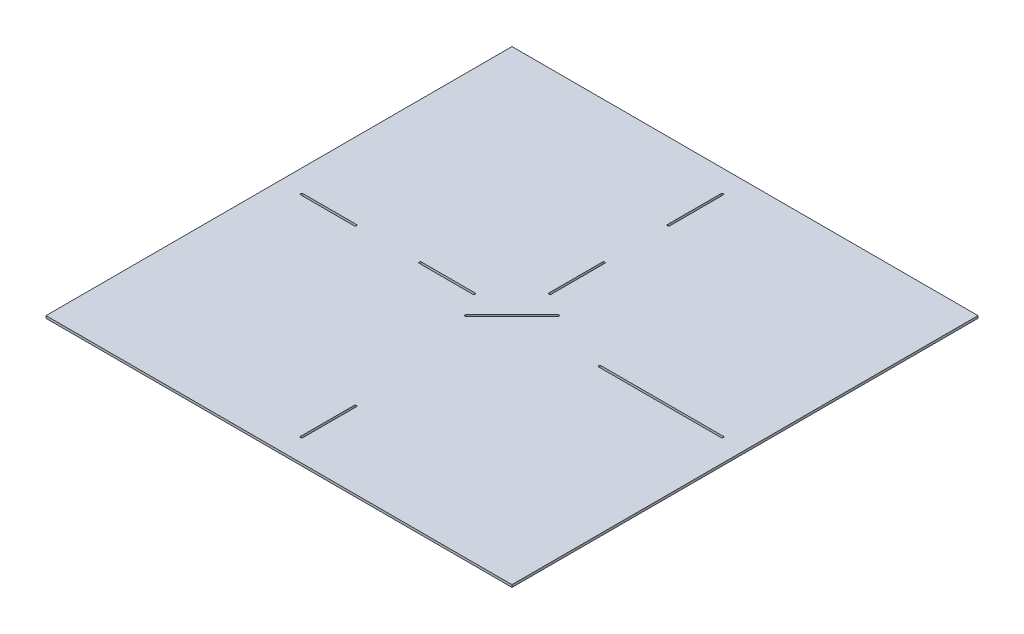
ISO-10303-21;
HEADER;
FILE_DESCRIPTION(('STEP AP214'),'2;1');
FILE_NAME('part.step','',(''),(''),'','','');
FILE_SCHEMA(('AUTOMOTIVE_DESIGN { 1 0 10303 214 1 1 1 1 }'));
ENDSEC;
DATA;
#1=APPLICATION_CONTEXT('core data for automotive mechanical design processes');
#2=APPLICATION_PROTOCOL_DEFINITION('international standard','automotive_design',2000,#1);
#3=PRODUCT_CONTEXT('',#1,'mechanical');
#4=PRODUCT('Part','Part','',(#3));
#5=PRODUCT_RELATED_PRODUCT_CATEGORY('part','',(#4));
#6=PRODUCT_DEFINITION_FORMATION('','',#4);
#7=PRODUCT_DEFINITION_CONTEXT('part definition',#1,'design');
#8=PRODUCT_DEFINITION('design','',#6,#7);
#9=PRODUCT_DEFINITION_SHAPE('','',#8);
#10=(LENGTH_UNIT() NAMED_UNIT(*) SI_UNIT(.MILLI.,.METRE.));
#11=(NAMED_UNIT(*) PLANE_ANGLE_UNIT() SI_UNIT($,.RADIAN.));
#12=(NAMED_UNIT(*) SI_UNIT($,.STERADIAN.) SOLID_ANGLE_UNIT());
#13=UNCERTAINTY_MEASURE_WITH_UNIT(LENGTH_MEASURE(1.E-05),#10,'distance_accuracy_value','');
#14=(GEOMETRIC_REPRESENTATION_CONTEXT(3) GLOBAL_UNCERTAINTY_ASSIGNED_CONTEXT((#13)) GLOBAL_UNIT_ASSIGNED_CONTEXT((#10,
#11,#12)) REPRESENTATION_CONTEXT('',''));
#15=CARTESIAN_POINT('',(0.,0.,0.));
#16=DIRECTION('',(0.,0.,1.));
#17=DIRECTION('',(1.,0.,0.));
#18=AXIS2_PLACEMENT_3D('',#15,#16,#17);
#19=CARTESIAN_POINT('',(304.8,3.175,304.8));
#20=DIRECTION('',(-1.,0.,0.));
#21=DIRECTION('',(0.,0.,1.));
#22=AXIS2_PLACEMENT_3D('',#19,#20,#21);
#23=PLANE('',#22);
#24=DIRECTION('',(0.,0.,-1.));
#25=VECTOR('',#24,1.);
#26=CARTESIAN_POINT('',(304.8,0.,304.8));
#27=LINE('',#26,#25);
#28=CARTESIAN_POINT('',(304.8,0.,304.8));
#29=VERTEX_POINT('',#28);
#30=CARTESIAN_POINT('',(304.8,0.,-304.8));
#31=VERTEX_POINT('',#30);
#32=EDGE_CURVE('E466',#29,#31,#27,.T.);
#33=ORIENTED_EDGE('',*,*,#32,.T.);
#34=DIRECTION('',(0.,-1.,0.));
#35=VECTOR('',#34,1.);
#36=CARTESIAN_POINT('',(304.8,3.175,-304.8));
#37=LINE('',#36,#35);
#38=CARTESIAN_POINT('',(304.8,3.175,-304.8));
#39=VERTEX_POINT('',#38);
#40=EDGE_CURVE('E11',#39,#31,#37,.T.);
#41=ORIENTED_EDGE('',*,*,#40,.F.);
#42=DIRECTION('',(0.,0.,-1.));
#43=VECTOR('',#42,1.);
#44=CARTESIAN_POINT('',(304.8,3.175,304.8));
#45=LINE('',#44,#43);
#46=CARTESIAN_POINT('',(304.8,3.175,304.8));
#47=VERTEX_POINT('',#46);
#48=EDGE_CURVE('E473',#47,#39,#45,.T.);
#49=ORIENTED_EDGE('',*,*,#48,.F.);
#50=DIRECTION('',(0.,-1.,0.));
#51=VECTOR('',#50,1.);
#52=CARTESIAN_POINT('',(304.8,3.175,304.8));
#53=LINE('',#52,#51);
#54=EDGE_CURVE('E483',#47,#29,#53,.T.);
#55=ORIENTED_EDGE('',*,*,#54,.T.);
#56=EDGE_LOOP('',(#33,#41,#49,#55));
#57=FACE_BOUND('',#56,.T.);
#58=ADVANCED_FACE('F33',(#57),#23,.F.);
#59=CARTESIAN_POINT('',(-304.8,3.175,-304.8));
#60=DIRECTION('',(0.,0.,1.));
#61=DIRECTION('',(1.,0.,0.));
#62=AXIS2_PLACEMENT_3D('',#59,#60,#61);
#63=PLANE('',#62);
#64=DIRECTION('',(-1.,0.,0.));
#65=VECTOR('',#64,1.);
#66=CARTESIAN_POINT('',(-304.8,0.,-304.8));
#67=LINE('',#66,#65);
#68=CARTESIAN_POINT('',(-304.8,0.,-304.8));
#69=VERTEX_POINT('',#68);
#70=EDGE_CURVE('E486',#31,#69,#67,.T.);
#71=ORIENTED_EDGE('',*,*,#70,.T.);
#72=DIRECTION('',(0.,-1.,0.));
#73=VECTOR('',#72,1.);
#74=CARTESIAN_POINT('',(-304.8,3.175,-304.8));
#75=LINE('',#74,#73);
#76=CARTESIAN_POINT('',(-304.8,3.175,-304.8));
#77=VERTEX_POINT('',#76);
#78=EDGE_CURVE('E40',#77,#69,#75,.T.);
#79=ORIENTED_EDGE('',*,*,#78,.F.);
#80=DIRECTION('',(-1.,0.,0.));
#81=VECTOR('',#80,1.);
#82=CARTESIAN_POINT('',(-304.8,3.175,-304.8));
#83=LINE('',#82,#81);
#84=EDGE_CURVE('E476',#39,#77,#83,.T.);
#85=ORIENTED_EDGE('',*,*,#84,.F.);
#86=ORIENTED_EDGE('',*,*,#40,.T.);
#87=EDGE_LOOP('',(#71,#79,#85,#86));
#88=FACE_BOUND('',#87,.T.);
#89=ADVANCED_FACE('F515',(#88),#63,.F.);
#90=CARTESIAN_POINT('',(-304.8,3.175,304.8));
#91=DIRECTION('',(1.,0.,0.));
#92=DIRECTION('',(0.,0.,-1.));
#93=AXIS2_PLACEMENT_3D('',#90,#91,#92);
#94=PLANE('',#93);
#95=DIRECTION('',(0.,0.,1.));
#96=VECTOR('',#95,1.);
#97=CARTESIAN_POINT('',(-304.8,0.,304.8));
#98=LINE('',#97,#96);
#99=CARTESIAN_POINT('',(-304.8,0.,304.8));
#100=VERTEX_POINT('',#99);
#101=EDGE_CURVE('E488',#69,#100,#98,.T.);
#102=ORIENTED_EDGE('',*,*,#101,.T.);
#103=DIRECTION('',(0.,-1.,0.));
#104=VECTOR('',#103,1.);
#105=CARTESIAN_POINT('',(-304.8,3.175,304.8));
#106=LINE('',#105,#104);
#107=CARTESIAN_POINT('',(-304.8,3.175,304.8));
#108=VERTEX_POINT('',#107);
#109=EDGE_CURVE('E493',#108,#100,#106,.T.);
#110=ORIENTED_EDGE('',*,*,#109,.F.);
#111=DIRECTION('',(0.,0.,1.));
#112=VECTOR('',#111,1.);
#113=CARTESIAN_POINT('',(-304.8,3.175,304.8));
#114=LINE('',#113,#112);
#115=EDGE_CURVE('E479',#77,#108,#114,.T.);
#116=ORIENTED_EDGE('',*,*,#115,.F.);
#117=ORIENTED_EDGE('',*,*,#78,.T.);
#118=EDGE_LOOP('',(#102,#110,#116,#117));
#119=FACE_BOUND('',#118,.T.);
#120=ADVANCED_FACE('F500',(#119),#94,.F.);
#121=CARTESIAN_POINT('',(-304.8,3.175,304.8));
#122=DIRECTION('',(0.,0.,-1.));
#123=DIRECTION('',(-1.,0.,0.));
#124=AXIS2_PLACEMENT_3D('',#121,#122,#123);
#125=PLANE('',#124);
#126=DIRECTION('',(1.,0.,0.));
#127=VECTOR('',#126,1.);
#128=CARTESIAN_POINT('',(-304.8,0.,304.8));
#129=LINE('',#128,#127);
#130=EDGE_CURVE('E477',#100,#29,#129,.T.);
#131=ORIENTED_EDGE('',*,*,#130,.T.);
#132=ORIENTED_EDGE('',*,*,#54,.F.);
#133=DIRECTION('',(1.,0.,0.));
#134=VECTOR('',#133,1.);
#135=CARTESIAN_POINT('',(-304.8,3.175,304.8));
#136=LINE('',#135,#134);
#137=EDGE_CURVE('E481',#108,#47,#136,.T.);
#138=ORIENTED_EDGE('',*,*,#137,.F.);
#139=ORIENTED_EDGE('',*,*,#109,.T.);
#140=EDGE_LOOP('',(#131,#132,#138,#139));
#141=FACE_BOUND('',#140,.T.);
#142=ADVANCED_FACE('F508',(#141),#125,.F.);
#143=CARTESIAN_POINT('',(0.,3.175,0.));
#144=DIRECTION('',(0.,-1.,0.));
#145=DIRECTION('',(0.,0.,-1.));
#146=AXIS2_PLACEMENT_3D('',#143,#144,#145);
#147=PLANE('',#146);
#148=DIRECTION('',(0.,0.,1.));
#149=VECTOR('',#148,1.);
#150=CARTESIAN_POINT('',(-1.5,3.175,-275.));
#151=LINE('',#150,#149);
#152=CARTESIAN_POINT('',(-1.5,3.175,-275.));
#153=VERTEX_POINT('',#152);
#154=CARTESIAN_POINT('',(-1.49999999999999,3.175,-205.));
#155=VERTEX_POINT('',#154);
#156=EDGE_CURVE('E331',#153,#155,#151,.T.);
#157=ORIENTED_EDGE('',*,*,#156,.F.);
#158=CARTESIAN_POINT('',(0.,3.175,-275.));
#159=DIRECTION('',(0.,1.,0.));
#160=DIRECTION('',(0.,0.,1.));
#161=AXIS2_PLACEMENT_3D('',#158,#159,#160);
#162=CIRCLE('',#161,1.5);
#163=CARTESIAN_POINT('',(1.5,3.175,-275.));
#164=VERTEX_POINT('',#163);
#165=EDGE_CURVE('E47',#164,#153,#162,.T.);
#166=ORIENTED_EDGE('',*,*,#165,.F.);
#167=DIRECTION('',(0.,0.,-1.));
#168=VECTOR('',#167,1.);
#169=CARTESIAN_POINT('',(1.5,3.175,-275.));
#170=LINE('',#169,#168);
#171=CARTESIAN_POINT('',(1.50000000000001,3.175,-205.));
#172=VERTEX_POINT('',#171);
#173=EDGE_CURVE('E320',#172,#164,#170,.T.);
#174=ORIENTED_EDGE('',*,*,#173,.F.);
#175=CARTESIAN_POINT('',(0.,3.175,-205.));
#176=DIRECTION('',(0.,1.,0.));
#177=DIRECTION('',(0.,0.,1.));
#178=AXIS2_PLACEMENT_3D('',#175,#176,#177);
#179=CIRCLE('',#178,1.5);
#180=EDGE_CURVE('E334',#155,#172,#179,.T.);
#181=ORIENTED_EDGE('',*,*,#180,.F.);
#182=EDGE_LOOP('',(#157,#166,#174,#181));
#183=FACE_BOUND('',#182,.T.);
#184=DIRECTION('',(1.,0.,0.));
#185=VECTOR('',#184,1.);
#186=CARTESIAN_POINT('',(-275.,3.175,1.50000000000007));
#187=LINE('',#186,#185);
#188=CARTESIAN_POINT('',(-275.,3.175,1.50000000000007));
#189=VERTEX_POINT('',#188);
#190=CARTESIAN_POINT('',(-205.,3.175,1.50000000000005));
#191=VERTEX_POINT('',#190);
#192=EDGE_CURVE('E301',#189,#191,#187,.T.);
#193=ORIENTED_EDGE('',*,*,#192,.F.);
#194=CARTESIAN_POINT('',(-275.,3.175,0.));
#195=DIRECTION('',(0.,1.,0.));
#196=DIRECTION('',(0.,0.,1.));
#197=AXIS2_PLACEMENT_3D('',#194,#195,#196);
#198=CIRCLE('',#197,1.5);
#199=CARTESIAN_POINT('',(-275.,3.175,-1.49999999999993));
#200=VERTEX_POINT('',#199);
#201=EDGE_CURVE('E55',#200,#189,#198,.T.);
#202=ORIENTED_EDGE('',*,*,#201,.F.);
#203=DIRECTION('',(-1.,0.,0.));
#204=VECTOR('',#203,1.);
#205=CARTESIAN_POINT('',(-275.,3.175,-1.49999999999993));
#206=LINE('',#205,#204);
#207=CARTESIAN_POINT('',(-205.,3.175,-1.49999999999995));
#208=VERTEX_POINT('',#207);
#209=EDGE_CURVE('E290',#208,#200,#206,.T.);
#210=ORIENTED_EDGE('',*,*,#209,.F.);
#211=CARTESIAN_POINT('',(-205.,3.175,0.));
#212=DIRECTION('',(0.,1.,0.));
#213=DIRECTION('',(0.,0.,1.));
#214=AXIS2_PLACEMENT_3D('',#211,#212,#213);
#215=CIRCLE('',#214,1.5);
#216=EDGE_CURVE('E305',#191,#208,#215,.T.);
#217=ORIENTED_EDGE('',*,*,#216,.F.);
#218=EDGE_LOOP('',(#193,#202,#210,#217));
#219=FACE_BOUND('',#218,.T.);
#220=DIRECTION('',(-1.,0.,0.));
#221=VECTOR('',#220,1.);
#222=CARTESIAN_POINT('',(275.,3.175,-1.5));
#223=LINE('',#222,#221);
#224=CARTESIAN_POINT('',(275.,3.175,-1.5));
#225=VERTEX_POINT('',#224);
#226=CARTESIAN_POINT('',(115.,3.175,-1.49999999999994));
#227=VERTEX_POINT('',#226);
#228=EDGE_CURVE('E275',#225,#227,#223,.T.);
#229=ORIENTED_EDGE('',*,*,#228,.F.);
#230=CARTESIAN_POINT('',(275.,3.175,0.));
#231=DIRECTION('',(0.,1.,0.));
#232=DIRECTION('',(0.,0.,1.));
#233=AXIS2_PLACEMENT_3D('',#230,#231,#232);
#234=CIRCLE('',#233,1.5);
#235=CARTESIAN_POINT('',(275.,3.175,1.5));
#236=VERTEX_POINT('',#235);
#237=EDGE_CURVE('E248',#236,#225,#234,.T.);
#238=ORIENTED_EDGE('',*,*,#237,.F.);
#239=DIRECTION('',(1.,0.,0.));
#240=VECTOR('',#239,1.);
#241=CARTESIAN_POINT('',(275.,3.175,1.5));
#242=LINE('',#241,#240);
#243=CARTESIAN_POINT('',(115.,3.175,1.50000000000006));
#244=VERTEX_POINT('',#243);
#245=EDGE_CURVE('E266',#244,#236,#242,.T.);
#246=ORIENTED_EDGE('',*,*,#245,.F.);
#247=CARTESIAN_POINT('',(115.,3.175,0.));
#248=DIRECTION('',(0.,1.,0.));
#249=DIRECTION('',(0.,0.,1.));
#250=AXIS2_PLACEMENT_3D('',#247,#248,#249);
#251=CIRCLE('',#250,1.5);
#252=EDGE_CURVE('E269',#227,#244,#251,.T.);
#253=ORIENTED_EDGE('',*,*,#252,.F.);
#254=EDGE_LOOP('',(#229,#238,#246,#253));
#255=FACE_BOUND('',#254,.T.);
#256=DIRECTION('',(0.,0.,-1.));
#257=VECTOR('',#256,1.);
#258=CARTESIAN_POINT('',(1.5,3.175,275.));
#259=LINE('',#258,#257);
#260=CARTESIAN_POINT('',(1.5,3.175,275.));
#261=VERTEX_POINT('',#260);
#262=CARTESIAN_POINT('',(1.5,3.175,205.));
#263=VERTEX_POINT('',#262);
#264=EDGE_CURVE('E394',#261,#263,#259,.T.);
#265=ORIENTED_EDGE('',*,*,#264,.F.);
#266=CARTESIAN_POINT('',(0.,3.175,275.));
#267=DIRECTION('',(0.,1.,0.));
#268=DIRECTION('',(0.,0.,1.));
#269=AXIS2_PLACEMENT_3D('',#266,#267,#268);
#270=CIRCLE('',#269,1.5);
#271=CARTESIAN_POINT('',(-1.5,3.175,275.));
#272=VERTEX_POINT('',#271);
#273=EDGE_CURVE('E282',#272,#261,#270,.T.);
#274=ORIENTED_EDGE('',*,*,#273,.F.);
#275=DIRECTION('',(0.,0.,1.));
#276=VECTOR('',#275,1.);
#277=CARTESIAN_POINT('',(-1.5,3.175,275.));
#278=LINE('',#277,#276);
#279=CARTESIAN_POINT('',(-1.5,3.175,205.));
#280=VERTEX_POINT('',#279);
#281=EDGE_CURVE('E383',#280,#272,#278,.T.);
#282=ORIENTED_EDGE('',*,*,#281,.F.);
#283=CARTESIAN_POINT('',(0.,3.175,205.));
#284=DIRECTION('',(0.,1.,0.));
#285=DIRECTION('',(0.,0.,1.));
#286=AXIS2_PLACEMENT_3D('',#283,#284,#285);
#287=CIRCLE('',#286,1.5);
#288=EDGE_CURVE('E397',#263,#280,#287,.T.);
#289=ORIENTED_EDGE('',*,*,#288,.F.);
#290=EDGE_LOOP('',(#265,#274,#282,#289));
#291=FACE_BOUND('',#290,.T.);
#292=DIRECTION('',(0.,0.,-1.));
#293=VECTOR('',#292,1.);
#294=CARTESIAN_POINT('',(1.5,3.175,-50.));
#295=LINE('',#294,#293);
#296=CARTESIAN_POINT('',(1.5,3.175,-50.));
#297=VERTEX_POINT('',#296);
#298=CARTESIAN_POINT('',(1.5,3.175,-120.));
#299=VERTEX_POINT('',#298);
#300=EDGE_CURVE('E361',#297,#299,#295,.T.);
#301=ORIENTED_EDGE('',*,*,#300,.F.);
#302=CARTESIAN_POINT('',(0.,3.175,-50.));
#303=DIRECTION('',(0.,1.,0.));
#304=DIRECTION('',(0.,0.,1.));
#305=AXIS2_PLACEMENT_3D('',#302,#303,#304);
#306=CIRCLE('',#305,1.5);
#307=CARTESIAN_POINT('',(-1.5,3.175,-50.));
#308=VERTEX_POINT('',#307);
#309=EDGE_CURVE('E359',#308,#297,#306,.T.);
#310=ORIENTED_EDGE('',*,*,#309,.F.);
#311=DIRECTION('',(0.,0.,1.));
#312=VECTOR('',#311,1.);
#313=CARTESIAN_POINT('',(-1.5,3.175,-50.));
#314=LINE('',#313,#312);
#315=CARTESIAN_POINT('',(-1.5,3.175,-120.));
#316=VERTEX_POINT('',#315);
#317=EDGE_CURVE('E349',#316,#308,#314,.T.);
#318=ORIENTED_EDGE('',*,*,#317,.F.);
#319=CARTESIAN_POINT('',(0.,3.175,-120.));
#320=DIRECTION('',(0.,1.,0.));
#321=DIRECTION('',(0.,0.,1.));
#322=AXIS2_PLACEMENT_3D('',#319,#320,#321);
#323=CIRCLE('',#322,1.5);
#324=EDGE_CURVE('E365',#299,#316,#323,.T.);
#325=ORIENTED_EDGE('',*,*,#324,.F.);
#326=EDGE_LOOP('',(#301,#310,#318,#325));
#327=FACE_BOUND('',#326,.T.);
#328=DIRECTION('',(-1.,0.,0.));
#329=VECTOR('',#328,1.);
#330=CARTESIAN_POINT('',(-50.,3.175,-1.49999999999995));
#331=LINE('',#330,#329);
#332=CARTESIAN_POINT('',(-50.,3.175,-1.49999999999995));
#333=VERTEX_POINT('',#332);
#334=CARTESIAN_POINT('',(-120.,3.175,-1.49999999999993));
#335=VERTEX_POINT('',#334);
#336=EDGE_CURVE('E424',#333,#335,#331,.T.);
#337=ORIENTED_EDGE('',*,*,#336,.F.);
#338=CARTESIAN_POINT('',(-50.,3.175,0.));
#339=DIRECTION('',(0.,1.,0.));
#340=DIRECTION('',(0.,0.,1.));
#341=AXIS2_PLACEMENT_3D('',#338,#339,#340);
#342=CIRCLE('',#341,1.5);
#343=CARTESIAN_POINT('',(-50.,3.175,1.50000000000004));
#344=VERTEX_POINT('',#343);
#345=EDGE_CURVE('E372',#344,#333,#342,.T.);
#346=ORIENTED_EDGE('',*,*,#345,.F.);
#347=DIRECTION('',(1.,0.,0.));
#348=VECTOR('',#347,1.);
#349=CARTESIAN_POINT('',(-50.,3.175,1.50000000000004));
#350=LINE('',#349,#348);
#351=CARTESIAN_POINT('',(-120.,3.175,1.50000000000007));
#352=VERTEX_POINT('',#351);
#353=EDGE_CURVE('E413',#352,#344,#350,.T.);
#354=ORIENTED_EDGE('',*,*,#353,.F.);
#355=CARTESIAN_POINT('',(-120.,3.175,0.));
#356=DIRECTION('',(0.,1.,0.));
#357=DIRECTION('',(0.,0.,1.));
#358=AXIS2_PLACEMENT_3D('',#355,#356,#357);
#359=CIRCLE('',#358,1.5);
#360=EDGE_CURVE('E427',#335,#352,#359,.T.);
#361=ORIENTED_EDGE('',*,*,#360,.F.);
#362=EDGE_LOOP('',(#337,#346,#354,#361));
#363=FACE_BOUND('',#362,.T.);
#364=DIRECTION('',(0.707106781186547,0.,-0.707106781186548));
#365=VECTOR('',#364,1.);
#366=CARTESIAN_POINT('',(-28.9393398282202,3.175,31.0606601717798));
#367=LINE('',#366,#365);
#368=CARTESIAN_POINT('',(-28.9393398282202,3.175,31.0606601717798));
#369=VERTEX_POINT('',#368);
#370=CARTESIAN_POINT('',(31.0606601717798,3.175,-28.9393398282202));
#371=VERTEX_POINT('',#370);
#372=EDGE_CURVE('E456',#369,#371,#367,.T.);
#373=ORIENTED_EDGE('',*,*,#372,.F.);
#374=CARTESIAN_POINT('',(-30.,3.175,30.));
#375=DIRECTION('',(0.,1.,0.));
#376=DIRECTION('',(0.,0.,1.));
#377=AXIS2_PLACEMENT_3D('',#374,#375,#376);
#378=CIRCLE('',#377,1.50000000000001);
#379=CARTESIAN_POINT('',(-31.0606601717798,3.175,28.9393398282202));
#380=VERTEX_POINT('',#379);
#381=EDGE_CURVE('E434',#380,#369,#378,.T.);
#382=ORIENTED_EDGE('',*,*,#381,.F.);
#383=DIRECTION('',(-0.707106781186547,0.,0.707106781186547));
#384=VECTOR('',#383,1.);
#385=CARTESIAN_POINT('',(-31.0606601717798,3.175,28.9393398282202));
#386=LINE('',#385,#384);
#387=CARTESIAN_POINT('',(28.9393398282202,3.175,-31.0606601717798));
#388=VERTEX_POINT('',#387);
#389=EDGE_CURVE('E445',#388,#380,#386,.T.);
#390=ORIENTED_EDGE('',*,*,#389,.F.);
#391=CARTESIAN_POINT('',(30.,3.175,-30.));
#392=DIRECTION('',(0.,1.,0.));
#393=DIRECTION('',(0.,0.,1.));
#394=AXIS2_PLACEMENT_3D('',#391,#392,#393);
#395=CIRCLE('',#394,1.49999999999999);
#396=EDGE_CURVE('E459',#371,#388,#395,.T.);
#397=ORIENTED_EDGE('',*,*,#396,.F.);
#398=EDGE_LOOP('',(#373,#382,#390,#397));
#399=FACE_BOUND('',#398,.T.);
#400=ORIENTED_EDGE('',*,*,#48,.T.);
#401=ORIENTED_EDGE('',*,*,#84,.T.);
#402=ORIENTED_EDGE('',*,*,#115,.T.);
#403=ORIENTED_EDGE('',*,*,#137,.T.);
#404=EDGE_LOOP('',(#400,#401,#402,#403));
#405=FACE_BOUND('',#404,.T.);
#406=ADVANCED_FACE('F514',(#183,#219,#255,#291,#327,#363,#399,#405),#147,.F.);
#407=CARTESIAN_POINT('',(0.,0.,0.));
#408=DIRECTION('',(0.,-1.,0.));
#409=DIRECTION('',(0.,0.,-1.));
#410=AXIS2_PLACEMENT_3D('',#407,#408,#409);
#411=PLANE('',#410);
#412=CARTESIAN_POINT('',(0.,0.,-275.));
#413=DIRECTION('',(0.,1.,0.));
#414=DIRECTION('',(0.,0.,1.));
#415=AXIS2_PLACEMENT_3D('',#412,#413,#414);
#416=CIRCLE('',#415,1.5);
#417=CARTESIAN_POINT('',(1.5,0.,-275.));
#418=VERTEX_POINT('',#417);
#419=CARTESIAN_POINT('',(-1.5,0.,-275.));
#420=VERTEX_POINT('',#419);
#421=EDGE_CURVE('E316',#418,#420,#416,.T.);
#422=ORIENTED_EDGE('',*,*,#421,.T.);
#423=DIRECTION('',(0.,0.,1.));
#424=VECTOR('',#423,1.);
#425=CARTESIAN_POINT('',(-1.5,0.,-275.));
#426=LINE('',#425,#424);
#427=CARTESIAN_POINT('',(-1.49999999999999,0.,-205.));
#428=VERTEX_POINT('',#427);
#429=EDGE_CURVE('E319',#420,#428,#426,.T.);
#430=ORIENTED_EDGE('',*,*,#429,.T.);
#431=CARTESIAN_POINT('',(0.,0.,-205.));
#432=DIRECTION('',(0.,1.,0.));
#433=DIRECTION('',(0.,0.,1.));
#434=AXIS2_PLACEMENT_3D('',#431,#432,#433);
#435=CIRCLE('',#434,1.5);
#436=CARTESIAN_POINT('',(1.50000000000001,0.,-205.));
#437=VERTEX_POINT('',#436);
#438=EDGE_CURVE('E323',#428,#437,#435,.T.);
#439=ORIENTED_EDGE('',*,*,#438,.T.);
#440=DIRECTION('',(0.,0.,-1.));
#441=VECTOR('',#440,1.);
#442=CARTESIAN_POINT('',(1.5,0.,-275.));
#443=LINE('',#442,#441);
#444=EDGE_CURVE('E326',#437,#418,#443,.T.);
#445=ORIENTED_EDGE('',*,*,#444,.T.);
#446=EDGE_LOOP('',(#422,#430,#439,#445));
#447=FACE_BOUND('',#446,.T.);
#448=CARTESIAN_POINT('',(-275.,0.,0.));
#449=DIRECTION('',(0.,1.,0.));
#450=DIRECTION('',(0.,0.,1.));
#451=AXIS2_PLACEMENT_3D('',#448,#449,#450);
#452=CIRCLE('',#451,1.5);
#453=CARTESIAN_POINT('',(-275.,0.,-1.49999999999993));
#454=VERTEX_POINT('',#453);
#455=CARTESIAN_POINT('',(-275.,0.,1.50000000000007));
#456=VERTEX_POINT('',#455);
#457=EDGE_CURVE('E286',#454,#456,#452,.T.);
#458=ORIENTED_EDGE('',*,*,#457,.T.);
#459=DIRECTION('',(1.,0.,0.));
#460=VECTOR('',#459,1.);
#461=CARTESIAN_POINT('',(-275.,0.,1.50000000000007));
#462=LINE('',#461,#460);
#463=CARTESIAN_POINT('',(-205.,0.,1.50000000000005));
#464=VERTEX_POINT('',#463);
#465=EDGE_CURVE('E289',#456,#464,#462,.T.);
#466=ORIENTED_EDGE('',*,*,#465,.T.);
#467=CARTESIAN_POINT('',(-205.,0.,0.));
#468=DIRECTION('',(0.,1.,0.));
#469=DIRECTION('',(0.,0.,1.));
#470=AXIS2_PLACEMENT_3D('',#467,#468,#469);
#471=CIRCLE('',#470,1.5);
#472=CARTESIAN_POINT('',(-205.,0.,-1.49999999999995));
#473=VERTEX_POINT('',#472);
#474=EDGE_CURVE('E293',#464,#473,#471,.T.);
#475=ORIENTED_EDGE('',*,*,#474,.T.);
#476=DIRECTION('',(-1.,0.,0.));
#477=VECTOR('',#476,1.);
#478=CARTESIAN_POINT('',(-275.,0.,-1.49999999999993));
#479=LINE('',#478,#477);
#480=EDGE_CURVE('E296',#473,#454,#479,.T.);
#481=ORIENTED_EDGE('',*,*,#480,.T.);
#482=EDGE_LOOP('',(#458,#466,#475,#481));
#483=FACE_BOUND('',#482,.T.);
#484=CARTESIAN_POINT('',(275.,0.,0.));
#485=DIRECTION('',(0.,1.,0.));
#486=DIRECTION('',(0.,0.,1.));
#487=AXIS2_PLACEMENT_3D('',#484,#485,#486);
#488=CIRCLE('',#487,1.5);
#489=CARTESIAN_POINT('',(275.,0.,1.5));
#490=VERTEX_POINT('',#489);
#491=CARTESIAN_POINT('',(275.,0.,-1.5));
#492=VERTEX_POINT('',#491);
#493=EDGE_CURVE('E245',#490,#492,#488,.T.);
#494=ORIENTED_EDGE('',*,*,#493,.T.);
#495=DIRECTION('',(-1.,0.,0.));
#496=VECTOR('',#495,1.);
#497=CARTESIAN_POINT('',(275.,0.,-1.5));
#498=LINE('',#497,#496);
#499=CARTESIAN_POINT('',(115.,0.,-1.49999999999994));
#500=VERTEX_POINT('',#499);
#501=EDGE_CURVE('E257',#492,#500,#498,.T.);
#502=ORIENTED_EDGE('',*,*,#501,.T.);
#503=CARTESIAN_POINT('',(115.,0.,0.));
#504=DIRECTION('',(0.,1.,0.));
#505=DIRECTION('',(0.,0.,1.));
#506=AXIS2_PLACEMENT_3D('',#503,#504,#505);
#507=CIRCLE('',#506,1.5);
#508=CARTESIAN_POINT('',(115.,0.,1.50000000000006));
#509=VERTEX_POINT('',#508);
#510=EDGE_CURVE('E261',#500,#509,#507,.T.);
#511=ORIENTED_EDGE('',*,*,#510,.T.);
#512=DIRECTION('',(1.,0.,0.));
#513=VECTOR('',#512,1.);
#514=CARTESIAN_POINT('',(275.,0.,1.5));
#515=LINE('',#514,#513);
#516=EDGE_CURVE('E253',#509,#490,#515,.T.);
#517=ORIENTED_EDGE('',*,*,#516,.T.);
#518=EDGE_LOOP('',(#494,#502,#511,#517));
#519=FACE_BOUND('',#518,.T.);
#520=CARTESIAN_POINT('',(0.,0.,275.));
#521=DIRECTION('',(0.,1.,0.));
#522=DIRECTION('',(0.,0.,1.));
#523=AXIS2_PLACEMENT_3D('',#520,#521,#522);
#524=CIRCLE('',#523,1.5);
#525=CARTESIAN_POINT('',(-1.5,0.,275.));
#526=VERTEX_POINT('',#525);
#527=CARTESIAN_POINT('',(1.5,0.,275.));
#528=VERTEX_POINT('',#527);
#529=EDGE_CURVE('E379',#526,#528,#524,.T.);
#530=ORIENTED_EDGE('',*,*,#529,.T.);
#531=DIRECTION('',(0.,0.,-1.));
#532=VECTOR('',#531,1.);
#533=CARTESIAN_POINT('',(1.5,0.,275.));
#534=LINE('',#533,#532);
#535=CARTESIAN_POINT('',(1.5,0.,205.));
#536=VERTEX_POINT('',#535);
#537=EDGE_CURVE('E382',#528,#536,#534,.T.);
#538=ORIENTED_EDGE('',*,*,#537,.T.);
#539=CARTESIAN_POINT('',(0.,0.,205.));
#540=DIRECTION('',(0.,1.,0.));
#541=DIRECTION('',(0.,0.,1.));
#542=AXIS2_PLACEMENT_3D('',#539,#540,#541);
#543=CIRCLE('',#542,1.5);
#544=CARTESIAN_POINT('',(-1.5,0.,205.));
#545=VERTEX_POINT('',#544);
#546=EDGE_CURVE('E386',#536,#545,#543,.T.);
#547=ORIENTED_EDGE('',*,*,#546,.T.);
#548=DIRECTION('',(0.,0.,1.));
#549=VECTOR('',#548,1.);
#550=CARTESIAN_POINT('',(-1.5,0.,275.));
#551=LINE('',#550,#549);
#552=EDGE_CURVE('E389',#545,#526,#551,.T.);
#553=ORIENTED_EDGE('',*,*,#552,.T.);
#554=EDGE_LOOP('',(#530,#538,#547,#553));
#555=FACE_BOUND('',#554,.T.);
#556=CARTESIAN_POINT('',(0.,0.,-50.));
#557=DIRECTION('',(0.,1.,0.));
#558=DIRECTION('',(0.,0.,1.));
#559=AXIS2_PLACEMENT_3D('',#556,#557,#558);
#560=CIRCLE('',#559,1.5);
#561=CARTESIAN_POINT('',(-1.5,0.,-50.));
#562=VERTEX_POINT('',#561);
#563=CARTESIAN_POINT('',(1.5,0.,-50.));
#564=VERTEX_POINT('',#563);
#565=EDGE_CURVE('E345',#562,#564,#560,.T.);
#566=ORIENTED_EDGE('',*,*,#565,.T.);
#567=DIRECTION('',(0.,0.,-1.));
#568=VECTOR('',#567,1.);
#569=CARTESIAN_POINT('',(1.5,0.,-50.));
#570=LINE('',#569,#568);
#571=CARTESIAN_POINT('',(1.5,0.,-120.));
#572=VERTEX_POINT('',#571);
#573=EDGE_CURVE('E348',#564,#572,#570,.T.);
#574=ORIENTED_EDGE('',*,*,#573,.T.);
#575=CARTESIAN_POINT('',(0.,0.,-120.));
#576=DIRECTION('',(0.,1.,0.));
#577=DIRECTION('',(0.,0.,1.));
#578=AXIS2_PLACEMENT_3D('',#575,#576,#577);
#579=CIRCLE('',#578,1.5);
#580=CARTESIAN_POINT('',(-1.5,0.,-120.));
#581=VERTEX_POINT('',#580);
#582=EDGE_CURVE('E352',#572,#581,#579,.T.);
#583=ORIENTED_EDGE('',*,*,#582,.T.);
#584=DIRECTION('',(0.,0.,1.));
#585=VECTOR('',#584,1.);
#586=CARTESIAN_POINT('',(-1.5,0.,-50.));
#587=LINE('',#586,#585);
#588=EDGE_CURVE('E355',#581,#562,#587,.T.);
#589=ORIENTED_EDGE('',*,*,#588,.T.);
#590=EDGE_LOOP('',(#566,#574,#583,#589));
#591=FACE_BOUND('',#590,.T.);
#592=CARTESIAN_POINT('',(-50.,0.,0.));
#593=DIRECTION('',(0.,1.,0.));
#594=DIRECTION('',(0.,0.,1.));
#595=AXIS2_PLACEMENT_3D('',#592,#593,#594);
#596=CIRCLE('',#595,1.5);
#597=CARTESIAN_POINT('',(-50.,0.,1.50000000000004));
#598=VERTEX_POINT('',#597);
#599=CARTESIAN_POINT('',(-50.,0.,-1.49999999999995));
#600=VERTEX_POINT('',#599);
#601=EDGE_CURVE('E409',#598,#600,#596,.T.);
#602=ORIENTED_EDGE('',*,*,#601,.T.);
#603=DIRECTION('',(-1.,0.,0.));
#604=VECTOR('',#603,1.);
#605=CARTESIAN_POINT('',(-50.,0.,-1.49999999999995));
#606=LINE('',#605,#604);
#607=CARTESIAN_POINT('',(-120.,0.,-1.49999999999993));
#608=VERTEX_POINT('',#607);
#609=EDGE_CURVE('E412',#600,#608,#606,.T.);
#610=ORIENTED_EDGE('',*,*,#609,.T.);
#611=CARTESIAN_POINT('',(-120.,0.,0.));
#612=DIRECTION('',(0.,1.,0.));
#613=DIRECTION('',(0.,0.,1.));
#614=AXIS2_PLACEMENT_3D('',#611,#612,#613);
#615=CIRCLE('',#614,1.5);
#616=CARTESIAN_POINT('',(-120.,0.,1.50000000000007));
#617=VERTEX_POINT('',#616);
#618=EDGE_CURVE('E416',#608,#617,#615,.T.);
#619=ORIENTED_EDGE('',*,*,#618,.T.);
#620=DIRECTION('',(1.,0.,0.));
#621=VECTOR('',#620,1.);
#622=CARTESIAN_POINT('',(-50.,0.,1.50000000000004));
#623=LINE('',#622,#621);
#624=EDGE_CURVE('E419',#617,#598,#623,.T.);
#625=ORIENTED_EDGE('',*,*,#624,.T.);
#626=EDGE_LOOP('',(#602,#610,#619,#625));
#627=FACE_BOUND('',#626,.T.);
#628=CARTESIAN_POINT('',(-30.,0.,30.));
#629=DIRECTION('',(0.,1.,0.));
#630=DIRECTION('',(0.,0.,1.));
#631=AXIS2_PLACEMENT_3D('',#628,#629,#630);
#632=CIRCLE('',#631,1.50000000000001);
#633=CARTESIAN_POINT('',(-31.0606601717798,0.,28.9393398282202));
#634=VERTEX_POINT('',#633);
#635=CARTESIAN_POINT('',(-28.9393398282202,0.,31.0606601717798));
#636=VERTEX_POINT('',#635);
#637=EDGE_CURVE('E441',#634,#636,#632,.T.);
#638=ORIENTED_EDGE('',*,*,#637,.T.);
#639=DIRECTION('',(0.707106781186547,0.,-0.707106781186548));
#640=VECTOR('',#639,1.);
#641=CARTESIAN_POINT('',(-28.9393398282202,0.,31.0606601717798));
#642=LINE('',#641,#640);
#643=CARTESIAN_POINT('',(31.0606601717798,0.,-28.9393398282202));
#644=VERTEX_POINT('',#643);
#645=EDGE_CURVE('E444',#636,#644,#642,.T.);
#646=ORIENTED_EDGE('',*,*,#645,.T.);
#647=CARTESIAN_POINT('',(30.,0.,-30.));
#648=DIRECTION('',(0.,1.,0.));
#649=DIRECTION('',(0.,0.,1.));
#650=AXIS2_PLACEMENT_3D('',#647,#648,#649);
#651=CIRCLE('',#650,1.49999999999999);
#652=CARTESIAN_POINT('',(28.9393398282202,0.,-31.0606601717798));
#653=VERTEX_POINT('',#652);
#654=EDGE_CURVE('E448',#644,#653,#651,.T.);
#655=ORIENTED_EDGE('',*,*,#654,.T.);
#656=DIRECTION('',(-0.707106781186547,0.,0.707106781186547));
#657=VECTOR('',#656,1.);
#658=CARTESIAN_POINT('',(-31.0606601717798,0.,28.9393398282202));
#659=LINE('',#658,#657);
#660=EDGE_CURVE('E451',#653,#634,#659,.T.);
#661=ORIENTED_EDGE('',*,*,#660,.T.);
#662=EDGE_LOOP('',(#638,#646,#655,#661));
#663=FACE_BOUND('',#662,.T.);
#664=ORIENTED_EDGE('',*,*,#32,.F.);
#665=ORIENTED_EDGE('',*,*,#130,.F.);
#666=ORIENTED_EDGE('',*,*,#101,.F.);
#667=ORIENTED_EDGE('',*,*,#70,.F.);
#668=EDGE_LOOP('',(#664,#665,#666,#667));
#669=FACE_BOUND('',#668,.T.);
#670=ADVANCED_FACE('F263',(#447,#483,#519,#555,#591,#627,#663,#669),#411,.T.);
#671=CARTESIAN_POINT('',(-30.,0.,30.));
#672=DIRECTION('',(0.,1.,0.));
#673=DIRECTION('',(0.,0.,1.));
#674=AXIS2_PLACEMENT_3D('',#671,#672,#673);
#675=CYLINDRICAL_SURFACE('',#674,1.50000000000001);
#676=ORIENTED_EDGE('',*,*,#381,.T.);
#677=DIRECTION('',(0.,1.,0.));
#678=VECTOR('',#677,1.);
#679=CARTESIAN_POINT('',(-28.9393398282202,0.,31.0606601717798));
#680=LINE('',#679,#678);
#681=EDGE_CURVE('E454',#636,#369,#680,.T.);
#682=ORIENTED_EDGE('',*,*,#681,.F.);
#683=ORIENTED_EDGE('',*,*,#637,.F.);
#684=DIRECTION('',(0.,1.,0.));
#685=VECTOR('',#684,1.);
#686=CARTESIAN_POINT('',(-31.0606601717798,0.,28.9393398282202));
#687=LINE('',#686,#685);
#688=EDGE_CURVE('E464',#634,#380,#687,.T.);
#689=ORIENTED_EDGE('',*,*,#688,.T.);
#690=EDGE_LOOP('',(#676,#682,#683,#689));
#691=FACE_BOUND('',#690,.T.);
#692=ADVANCED_FACE('F527',(#691),#675,.F.);
#693=CARTESIAN_POINT('',(-31.0606601717798,0.,28.9393398282202));
#694=DIRECTION('',(-0.707106781186548,0.,-0.707106781186548));
#695=DIRECTION('',(-0.707106781186548,0.,0.707106781186548));
#696=AXIS2_PLACEMENT_3D('',#693,#694,#695);
#697=PLANE('',#696);
#698=ORIENTED_EDGE('',*,*,#389,.T.);
#699=ORIENTED_EDGE('',*,*,#688,.F.);
#700=ORIENTED_EDGE('',*,*,#660,.F.);
#701=DIRECTION('',(0.,1.,0.));
#702=VECTOR('',#701,1.);
#703=CARTESIAN_POINT('',(28.9393398282202,0.,-31.0606601717798));
#704=LINE('',#703,#702);
#705=EDGE_CURVE('E467',#653,#388,#704,.T.);
#706=ORIENTED_EDGE('',*,*,#705,.T.);
#707=EDGE_LOOP('',(#698,#699,#700,#706));
#708=FACE_BOUND('',#707,.T.);
#709=ADVANCED_FACE('F534',(#708),#697,.F.);
#710=CARTESIAN_POINT('',(30.,0.,-30.));
#711=DIRECTION('',(0.,1.,0.));
#712=DIRECTION('',(0.,0.,1.));
#713=AXIS2_PLACEMENT_3D('',#710,#711,#712);
#714=CYLINDRICAL_SURFACE('',#713,1.49999999999999);
#715=ORIENTED_EDGE('',*,*,#396,.T.);
#716=ORIENTED_EDGE('',*,*,#705,.F.);
#717=ORIENTED_EDGE('',*,*,#654,.F.);
#718=DIRECTION('',(0.,1.,0.));
#719=VECTOR('',#718,1.);
#720=CARTESIAN_POINT('',(31.0606601717798,0.,-28.9393398282202));
#721=LINE('',#720,#719);
#722=EDGE_CURVE('E469',#644,#371,#721,.T.);
#723=ORIENTED_EDGE('',*,*,#722,.T.);
#724=EDGE_LOOP('',(#715,#716,#717,#723));
#725=FACE_BOUND('',#724,.T.);
#726=ADVANCED_FACE('F540',(#725),#714,.F.);
#727=CARTESIAN_POINT('',(-28.9393398282202,0.,31.0606601717798));
#728=DIRECTION('',(0.707106781186548,0.,0.707106781186547));
#729=DIRECTION('',(0.707106781186547,0.,-0.707106781186548));
#730=AXIS2_PLACEMENT_3D('',#727,#728,#729);
#731=PLANE('',#730);
#732=ORIENTED_EDGE('',*,*,#372,.T.);
#733=ORIENTED_EDGE('',*,*,#722,.F.);
#734=ORIENTED_EDGE('',*,*,#645,.F.);
#735=ORIENTED_EDGE('',*,*,#681,.T.);
#736=EDGE_LOOP('',(#732,#733,#734,#735));
#737=FACE_BOUND('',#736,.T.);
#738=ADVANCED_FACE('F536',(#737),#731,.F.);
#739=CARTESIAN_POINT('',(-50.,0.,0.));
#740=DIRECTION('',(0.,1.,0.));
#741=DIRECTION('',(0.,0.,1.));
#742=AXIS2_PLACEMENT_3D('',#739,#740,#741);
#743=CYLINDRICAL_SURFACE('',#742,1.5);
#744=ORIENTED_EDGE('',*,*,#345,.T.);
#745=DIRECTION('',(0.,1.,0.));
#746=VECTOR('',#745,1.);
#747=CARTESIAN_POINT('',(-50.,0.,-1.49999999999995));
#748=LINE('',#747,#746);
#749=EDGE_CURVE('E422',#600,#333,#748,.T.);
#750=ORIENTED_EDGE('',*,*,#749,.F.);
#751=ORIENTED_EDGE('',*,*,#601,.F.);
#752=DIRECTION('',(0.,1.,0.));
#753=VECTOR('',#752,1.);
#754=CARTESIAN_POINT('',(-50.,0.,1.50000000000004));
#755=LINE('',#754,#753);
#756=EDGE_CURVE('E432',#598,#344,#755,.T.);
#757=ORIENTED_EDGE('',*,*,#756,.T.);
#758=EDGE_LOOP('',(#744,#750,#751,#757));
#759=FACE_BOUND('',#758,.T.);
#760=ADVANCED_FACE('F539',(#759),#743,.F.);
#761=CARTESIAN_POINT('',(-50.,0.,1.50000000000004));
#762=DIRECTION('',(0.,0.,1.));
#763=DIRECTION('',(1.,0.,0.));
#764=AXIS2_PLACEMENT_3D('',#761,#762,#763);
#765=PLANE('',#764);
#766=ORIENTED_EDGE('',*,*,#353,.T.);
#767=ORIENTED_EDGE('',*,*,#756,.F.);
#768=ORIENTED_EDGE('',*,*,#624,.F.);
#769=DIRECTION('',(0.,1.,0.));
#770=VECTOR('',#769,1.);
#771=CARTESIAN_POINT('',(-120.,0.,1.50000000000007));
#772=LINE('',#771,#770);
#773=EDGE_CURVE('E435',#617,#352,#772,.T.);
#774=ORIENTED_EDGE('',*,*,#773,.T.);
#775=EDGE_LOOP('',(#766,#767,#768,#774));
#776=FACE_BOUND('',#775,.T.);
#777=ADVANCED_FACE('F550',(#776),#765,.F.);
#778=CARTESIAN_POINT('',(-120.,0.,0.));
#779=DIRECTION('',(0.,1.,0.));
#780=DIRECTION('',(0.,0.,1.));
#781=AXIS2_PLACEMENT_3D('',#778,#779,#780);
#782=CYLINDRICAL_SURFACE('',#781,1.5);
#783=ORIENTED_EDGE('',*,*,#360,.T.);
#784=ORIENTED_EDGE('',*,*,#773,.F.);
#785=ORIENTED_EDGE('',*,*,#618,.F.);
#786=DIRECTION('',(0.,1.,0.));
#787=VECTOR('',#786,1.);
#788=CARTESIAN_POINT('',(-120.,0.,-1.49999999999993));
#789=LINE('',#788,#787);
#790=EDGE_CURVE('E437',#608,#335,#789,.T.);
#791=ORIENTED_EDGE('',*,*,#790,.T.);
#792=EDGE_LOOP('',(#783,#784,#785,#791));
#793=FACE_BOUND('',#792,.T.);
#794=ADVANCED_FACE('F556',(#793),#782,.F.);
#795=CARTESIAN_POINT('',(-50.,0.,-1.49999999999995));
#796=DIRECTION('',(0.,0.,-1.));
#797=DIRECTION('',(-1.,0.,0.));
#798=AXIS2_PLACEMENT_3D('',#795,#796,#797);
#799=PLANE('',#798);
#800=ORIENTED_EDGE('',*,*,#336,.T.);
#801=ORIENTED_EDGE('',*,*,#790,.F.);
#802=ORIENTED_EDGE('',*,*,#609,.F.);
#803=ORIENTED_EDGE('',*,*,#749,.T.);
#804=EDGE_LOOP('',(#800,#801,#802,#803));
#805=FACE_BOUND('',#804,.T.);
#806=ADVANCED_FACE('F552',(#805),#799,.F.);
#807=CARTESIAN_POINT('',(0.,0.,-50.));
#808=DIRECTION('',(0.,1.,0.));
#809=DIRECTION('',(0.,0.,1.));
#810=AXIS2_PLACEMENT_3D('',#807,#808,#809);
#811=CYLINDRICAL_SURFACE('',#810,1.5);
#812=ORIENTED_EDGE('',*,*,#309,.T.);
#813=DIRECTION('',(0.,1.,0.));
#814=VECTOR('',#813,1.);
#815=CARTESIAN_POINT('',(1.5,0.,-50.));
#816=LINE('',#815,#814);
#817=EDGE_CURVE('E358',#564,#297,#816,.T.);
#818=ORIENTED_EDGE('',*,*,#817,.F.);
#819=ORIENTED_EDGE('',*,*,#565,.F.);
#820=DIRECTION('',(0.,1.,0.));
#821=VECTOR('',#820,1.);
#822=CARTESIAN_POINT('',(-1.5,0.,-50.));
#823=LINE('',#822,#821);
#824=EDGE_CURVE('E370',#562,#308,#823,.T.);
#825=ORIENTED_EDGE('',*,*,#824,.T.);
#826=EDGE_LOOP('',(#812,#818,#819,#825));
#827=FACE_BOUND('',#826,.T.);
#828=ADVANCED_FACE('F555',(#827),#811,.F.);
#829=CARTESIAN_POINT('',(-1.5,0.,-50.));
#830=DIRECTION('',(-1.,0.,0.));
#831=DIRECTION('',(0.,0.,1.));
#832=AXIS2_PLACEMENT_3D('',#829,#830,#831);
#833=PLANE('',#832);
#834=ORIENTED_EDGE('',*,*,#317,.T.);
#835=ORIENTED_EDGE('',*,*,#824,.F.);
#836=ORIENTED_EDGE('',*,*,#588,.F.);
#837=DIRECTION('',(0.,1.,0.));
#838=VECTOR('',#837,1.);
#839=CARTESIAN_POINT('',(-1.5,0.,-120.));
#840=LINE('',#839,#838);
#841=EDGE_CURVE('E373',#581,#316,#840,.T.);
#842=ORIENTED_EDGE('',*,*,#841,.T.);
#843=EDGE_LOOP('',(#834,#835,#836,#842));
#844=FACE_BOUND('',#843,.T.);
#845=ADVANCED_FACE('F583',(#844),#833,.F.);
#846=CARTESIAN_POINT('',(0.,0.,-120.));
#847=DIRECTION('',(0.,1.,0.));
#848=DIRECTION('',(0.,0.,1.));
#849=AXIS2_PLACEMENT_3D('',#846,#847,#848);
#850=CYLINDRICAL_SURFACE('',#849,1.5);
#851=ORIENTED_EDGE('',*,*,#324,.T.);
#852=ORIENTED_EDGE('',*,*,#841,.F.);
#853=ORIENTED_EDGE('',*,*,#582,.F.);
#854=DIRECTION('',(0.,1.,0.));
#855=VECTOR('',#854,1.);
#856=CARTESIAN_POINT('',(1.5,0.,-120.));
#857=LINE('',#856,#855);
#858=EDGE_CURVE('E375',#572,#299,#857,.T.);
#859=ORIENTED_EDGE('',*,*,#858,.T.);
#860=EDGE_LOOP('',(#851,#852,#853,#859));
#861=FACE_BOUND('',#860,.T.);
#862=ADVANCED_FACE('F587',(#861),#850,.F.);
#863=CARTESIAN_POINT('',(1.5,0.,-50.));
#864=DIRECTION('',(1.,0.,0.));
#865=DIRECTION('',(0.,0.,-1.));
#866=AXIS2_PLACEMENT_3D('',#863,#864,#865);
#867=PLANE('',#866);
#868=ORIENTED_EDGE('',*,*,#300,.T.);
#869=ORIENTED_EDGE('',*,*,#858,.F.);
#870=ORIENTED_EDGE('',*,*,#573,.F.);
#871=ORIENTED_EDGE('',*,*,#817,.T.);
#872=EDGE_LOOP('',(#868,#869,#870,#871));
#873=FACE_BOUND('',#872,.T.);
#874=ADVANCED_FACE('F568',(#873),#867,.F.);
#875=CARTESIAN_POINT('',(0.,0.,275.));
#876=DIRECTION('',(0.,1.,0.));
#877=DIRECTION('',(0.,0.,1.));
#878=AXIS2_PLACEMENT_3D('',#875,#876,#877);
#879=CYLINDRICAL_SURFACE('',#878,1.5);
#880=ORIENTED_EDGE('',*,*,#273,.T.);
#881=DIRECTION('',(0.,1.,0.));
#882=VECTOR('',#881,1.);
#883=CARTESIAN_POINT('',(1.5,0.,275.));
#884=LINE('',#883,#882);
#885=EDGE_CURVE('E392',#528,#261,#884,.T.);
#886=ORIENTED_EDGE('',*,*,#885,.F.);
#887=ORIENTED_EDGE('',*,*,#529,.F.);
#888=DIRECTION('',(0.,1.,0.));
#889=VECTOR('',#888,1.);
#890=CARTESIAN_POINT('',(-1.5,0.,275.));
#891=LINE('',#890,#889);
#892=EDGE_CURVE('E362',#526,#272,#891,.T.);
#893=ORIENTED_EDGE('',*,*,#892,.T.);
#894=EDGE_LOOP('',(#880,#886,#887,#893));
#895=FACE_BOUND('',#894,.T.);
#896=ADVANCED_FACE('F564',(#895),#879,.F.);
#897=CARTESIAN_POINT('',(-1.5,0.,275.));
#898=DIRECTION('',(-1.,0.,0.));
#899=DIRECTION('',(0.,0.,1.));
#900=AXIS2_PLACEMENT_3D('',#897,#898,#899);
#901=PLANE('',#900);
#902=ORIENTED_EDGE('',*,*,#281,.T.);
#903=ORIENTED_EDGE('',*,*,#892,.F.);
#904=ORIENTED_EDGE('',*,*,#552,.F.);
#905=DIRECTION('',(0.,1.,0.));
#906=VECTOR('',#905,1.);
#907=CARTESIAN_POINT('',(-1.5,0.,205.));
#908=LINE('',#907,#906);
#909=EDGE_CURVE('E403',#545,#280,#908,.T.);
#910=ORIENTED_EDGE('',*,*,#909,.T.);
#911=EDGE_LOOP('',(#902,#903,#904,#910));
#912=FACE_BOUND('',#911,.T.);
#913=ADVANCED_FACE('F567',(#912),#901,.F.);
#914=CARTESIAN_POINT('',(0.,0.,205.));
#915=DIRECTION('',(0.,1.,0.));
#916=DIRECTION('',(0.,0.,1.));
#917=AXIS2_PLACEMENT_3D('',#914,#915,#916);
#918=CYLINDRICAL_SURFACE('',#917,1.5);
#919=ORIENTED_EDGE('',*,*,#288,.T.);
#920=ORIENTED_EDGE('',*,*,#909,.F.);
#921=ORIENTED_EDGE('',*,*,#546,.F.);
#922=DIRECTION('',(0.,1.,0.));
#923=VECTOR('',#922,1.);
#924=CARTESIAN_POINT('',(1.5,0.,205.));
#925=LINE('',#924,#923);
#926=EDGE_CURVE('E405',#536,#263,#925,.T.);
#927=ORIENTED_EDGE('',*,*,#926,.T.);
#928=EDGE_LOOP('',(#919,#920,#921,#927));
#929=FACE_BOUND('',#928,.T.);
#930=ADVANCED_FACE('F573',(#929),#918,.F.);
#931=CARTESIAN_POINT('',(1.5,0.,275.));
#932=DIRECTION('',(1.,0.,0.));
#933=DIRECTION('',(0.,0.,-1.));
#934=AXIS2_PLACEMENT_3D('',#931,#932,#933);
#935=PLANE('',#934);
#936=ORIENTED_EDGE('',*,*,#264,.T.);
#937=ORIENTED_EDGE('',*,*,#926,.F.);
#938=ORIENTED_EDGE('',*,*,#537,.F.);
#939=ORIENTED_EDGE('',*,*,#885,.T.);
#940=EDGE_LOOP('',(#936,#937,#938,#939));
#941=FACE_BOUND('',#940,.T.);
#942=ADVANCED_FACE('F570',(#941),#935,.F.);
#943=CARTESIAN_POINT('',(275.,0.,0.));
#944=DIRECTION('',(0.,1.,0.));
#945=DIRECTION('',(0.,0.,1.));
#946=AXIS2_PLACEMENT_3D('',#943,#944,#945);
#947=CYLINDRICAL_SURFACE('',#946,1.5);
#948=ORIENTED_EDGE('',*,*,#237,.T.);
#949=DIRECTION('',(0.,1.,0.));
#950=VECTOR('',#949,1.);
#951=CARTESIAN_POINT('',(275.,0.,-1.5));
#952=LINE('',#951,#950);
#953=EDGE_CURVE('E241',#492,#225,#952,.T.);
#954=ORIENTED_EDGE('',*,*,#953,.F.);
#955=ORIENTED_EDGE('',*,*,#493,.F.);
#956=DIRECTION('',(0.,1.,0.));
#957=VECTOR('',#956,1.);
#958=CARTESIAN_POINT('',(275.,0.,1.5));
#959=LINE('',#958,#957);
#960=EDGE_CURVE('E280',#490,#236,#959,.T.);
#961=ORIENTED_EDGE('',*,*,#960,.T.);
#962=EDGE_LOOP('',(#948,#954,#955,#961));
#963=FACE_BOUND('',#962,.T.);
#964=ADVANCED_FACE('F243',(#963),#947,.F.);
#965=CARTESIAN_POINT('',(275.,0.,1.5));
#966=DIRECTION('',(0.,0.,1.));
#967=DIRECTION('',(1.,0.,0.));
#968=AXIS2_PLACEMENT_3D('',#965,#966,#967);
#969=PLANE('',#968);
#970=ORIENTED_EDGE('',*,*,#245,.T.);
#971=ORIENTED_EDGE('',*,*,#960,.F.);
#972=ORIENTED_EDGE('',*,*,#516,.F.);
#973=DIRECTION('',(0.,1.,0.));
#974=VECTOR('',#973,1.);
#975=CARTESIAN_POINT('',(115.,0.,1.50000000000006));
#976=LINE('',#975,#974);
#977=EDGE_CURVE('E283',#509,#244,#976,.T.);
#978=ORIENTED_EDGE('',*,*,#977,.T.);
#979=EDGE_LOOP('',(#970,#971,#972,#978));
#980=FACE_BOUND('',#979,.T.);
#981=ADVANCED_FACE('F627',(#980),#969,.F.);
#982=CARTESIAN_POINT('',(115.,0.,0.));
#983=DIRECTION('',(0.,1.,0.));
#984=DIRECTION('',(0.,0.,1.));
#985=AXIS2_PLACEMENT_3D('',#982,#983,#984);
#986=CYLINDRICAL_SURFACE('',#985,1.5);
#987=ORIENTED_EDGE('',*,*,#252,.T.);
#988=ORIENTED_EDGE('',*,*,#977,.F.);
#989=ORIENTED_EDGE('',*,*,#510,.F.);
#990=DIRECTION('',(0.,1.,0.));
#991=VECTOR('',#990,1.);
#992=CARTESIAN_POINT('',(115.,0.,-1.49999999999994));
#993=LINE('',#992,#991);
#994=EDGE_CURVE('E252',#500,#227,#993,.T.);
#995=ORIENTED_EDGE('',*,*,#994,.T.);
#996=EDGE_LOOP('',(#987,#988,#989,#995));
#997=FACE_BOUND('',#996,.T.);
#998=ADVANCED_FACE('F630',(#997),#986,.F.);
#999=CARTESIAN_POINT('',(275.,0.,-1.5));
#1000=DIRECTION('',(0.,0.,-1.));
#1001=DIRECTION('',(-1.,0.,0.));
#1002=AXIS2_PLACEMENT_3D('',#999,#1000,#1001);
#1003=PLANE('',#1002);
#1004=ORIENTED_EDGE('',*,*,#228,.T.);
#1005=ORIENTED_EDGE('',*,*,#994,.F.);
#1006=ORIENTED_EDGE('',*,*,#501,.F.);
#1007=ORIENTED_EDGE('',*,*,#953,.T.);
#1008=EDGE_LOOP('',(#1004,#1005,#1006,#1007));
#1009=FACE_BOUND('',#1008,.T.);
#1010=ADVANCED_FACE('F258',(#1009),#1003,.F.);
#1011=CARTESIAN_POINT('',(-275.,0.,0.));
#1012=DIRECTION('',(0.,1.,0.));
#1013=DIRECTION('',(0.,0.,1.));
#1014=AXIS2_PLACEMENT_3D('',#1011,#1012,#1013);
#1015=CYLINDRICAL_SURFACE('',#1014,1.5);
#1016=ORIENTED_EDGE('',*,*,#201,.T.);
#1017=DIRECTION('',(0.,1.,0.));
#1018=VECTOR('',#1017,1.);
#1019=CARTESIAN_POINT('',(-275.,0.,1.50000000000007));
#1020=LINE('',#1019,#1018);
#1021=EDGE_CURVE('E299',#456,#189,#1020,.T.);
#1022=ORIENTED_EDGE('',*,*,#1021,.F.);
#1023=ORIENTED_EDGE('',*,*,#457,.F.);
#1024=DIRECTION('',(0.,1.,0.));
#1025=VECTOR('',#1024,1.);
#1026=CARTESIAN_POINT('',(-275.,0.,-1.49999999999993));
#1027=LINE('',#1026,#1025);
#1028=EDGE_CURVE('E276',#454,#200,#1027,.T.);
#1029=ORIENTED_EDGE('',*,*,#1028,.T.);
#1030=EDGE_LOOP('',(#1016,#1022,#1023,#1029));
#1031=FACE_BOUND('',#1030,.T.);
#1032=ADVANCED_FACE('F611',(#1031),#1015,.F.);
#1033=CARTESIAN_POINT('',(-275.,0.,-1.49999999999993));
#1034=DIRECTION('',(0.,0.,-1.));
#1035=DIRECTION('',(-1.,0.,0.));
#1036=AXIS2_PLACEMENT_3D('',#1033,#1034,#1035);
#1037=PLANE('',#1036);
#1038=ORIENTED_EDGE('',*,*,#209,.T.);
#1039=ORIENTED_EDGE('',*,*,#1028,.F.);
#1040=ORIENTED_EDGE('',*,*,#480,.F.);
#1041=DIRECTION('',(0.,1.,0.));
#1042=VECTOR('',#1041,1.);
#1043=CARTESIAN_POINT('',(-205.,0.,-1.49999999999995));
#1044=LINE('',#1043,#1042);
#1045=EDGE_CURVE('E311',#473,#208,#1044,.T.);
#1046=ORIENTED_EDGE('',*,*,#1045,.T.);
#1047=EDGE_LOOP('',(#1038,#1039,#1040,#1046));
#1048=FACE_BOUND('',#1047,.T.);
#1049=ADVANCED_FACE('F614',(#1048),#1037,.F.);
#1050=CARTESIAN_POINT('',(-205.,0.,0.));
#1051=DIRECTION('',(0.,1.,0.));
#1052=DIRECTION('',(0.,0.,1.));
#1053=AXIS2_PLACEMENT_3D('',#1050,#1051,#1052);
#1054=CYLINDRICAL_SURFACE('',#1053,1.5);
#1055=ORIENTED_EDGE('',*,*,#216,.T.);
#1056=ORIENTED_EDGE('',*,*,#1045,.F.);
#1057=ORIENTED_EDGE('',*,*,#474,.F.);
#1058=DIRECTION('',(0.,1.,0.));
#1059=VECTOR('',#1058,1.);
#1060=CARTESIAN_POINT('',(-205.,0.,1.50000000000005));
#1061=LINE('',#1060,#1059);
#1062=EDGE_CURVE('E313',#464,#191,#1061,.T.);
#1063=ORIENTED_EDGE('',*,*,#1062,.T.);
#1064=EDGE_LOOP('',(#1055,#1056,#1057,#1063));
#1065=FACE_BOUND('',#1064,.T.);
#1066=ADVANCED_FACE('F617',(#1065),#1054,.F.);
#1067=CARTESIAN_POINT('',(-275.,0.,1.50000000000007));
#1068=DIRECTION('',(0.,0.,1.));
#1069=DIRECTION('',(1.,0.,0.));
#1070=AXIS2_PLACEMENT_3D('',#1067,#1068,#1069);
#1071=PLANE('',#1070);
#1072=ORIENTED_EDGE('',*,*,#192,.T.);
#1073=ORIENTED_EDGE('',*,*,#1062,.F.);
#1074=ORIENTED_EDGE('',*,*,#465,.F.);
#1075=ORIENTED_EDGE('',*,*,#1021,.T.);
#1076=EDGE_LOOP('',(#1072,#1073,#1074,#1075));
#1077=FACE_BOUND('',#1076,.T.);
#1078=ADVANCED_FACE('F599',(#1077),#1071,.F.);
#1079=CARTESIAN_POINT('',(0.,0.,-275.));
#1080=DIRECTION('',(0.,1.,0.));
#1081=DIRECTION('',(0.,0.,1.));
#1082=AXIS2_PLACEMENT_3D('',#1079,#1080,#1081);
#1083=CYLINDRICAL_SURFACE('',#1082,1.5);
#1084=ORIENTED_EDGE('',*,*,#165,.T.);
#1085=DIRECTION('',(0.,1.,0.));
#1086=VECTOR('',#1085,1.);
#1087=CARTESIAN_POINT('',(-1.5,0.,-275.));
#1088=LINE('',#1087,#1086);
#1089=EDGE_CURVE('E329',#420,#153,#1088,.T.);
#1090=ORIENTED_EDGE('',*,*,#1089,.F.);
#1091=ORIENTED_EDGE('',*,*,#421,.F.);
#1092=DIRECTION('',(0.,1.,0.));
#1093=VECTOR('',#1092,1.);
#1094=CARTESIAN_POINT('',(1.5,0.,-275.));
#1095=LINE('',#1094,#1093);
#1096=EDGE_CURVE('E302',#418,#164,#1095,.T.);
#1097=ORIENTED_EDGE('',*,*,#1096,.T.);
#1098=EDGE_LOOP('',(#1084,#1090,#1091,#1097));
#1099=FACE_BOUND('',#1098,.T.);
#1100=ADVANCED_FACE('F595',(#1099),#1083,.F.);
#1101=CARTESIAN_POINT('',(1.5,0.,-275.));
#1102=DIRECTION('',(1.,0.,0.));
#1103=DIRECTION('',(0.,0.,-1.));
#1104=AXIS2_PLACEMENT_3D('',#1101,#1102,#1103);
#1105=PLANE('',#1104);
#1106=ORIENTED_EDGE('',*,*,#173,.T.);
#1107=ORIENTED_EDGE('',*,*,#1096,.F.);
#1108=ORIENTED_EDGE('',*,*,#444,.F.);
#1109=DIRECTION('',(0.,1.,0.));
#1110=VECTOR('',#1109,1.);
#1111=CARTESIAN_POINT('',(1.50000000000001,0.,-205.));
#1112=LINE('',#1111,#1110);
#1113=EDGE_CURVE('E340',#437,#172,#1112,.T.);
#1114=ORIENTED_EDGE('',*,*,#1113,.T.);
#1115=EDGE_LOOP('',(#1106,#1107,#1108,#1114));
#1116=FACE_BOUND('',#1115,.T.);
#1117=ADVANCED_FACE('F598',(#1116),#1105,.F.);
#1118=CARTESIAN_POINT('',(0.,0.,-205.));
#1119=DIRECTION('',(0.,1.,0.));
#1120=DIRECTION('',(0.,0.,1.));
#1121=AXIS2_PLACEMENT_3D('',#1118,#1119,#1120);
#1122=CYLINDRICAL_SURFACE('',#1121,1.5);
#1123=ORIENTED_EDGE('',*,*,#180,.T.);
#1124=ORIENTED_EDGE('',*,*,#1113,.F.);
#1125=ORIENTED_EDGE('',*,*,#438,.F.);
#1126=DIRECTION('',(0.,1.,0.));
#1127=VECTOR('',#1126,1.);
#1128=CARTESIAN_POINT('',(-1.49999999999999,0.,-205.));
#1129=LINE('',#1128,#1127);
#1130=EDGE_CURVE('E342',#428,#155,#1129,.T.);
#1131=ORIENTED_EDGE('',*,*,#1130,.T.);
#1132=EDGE_LOOP('',(#1123,#1124,#1125,#1131));
#1133=FACE_BOUND('',#1132,.T.);
#1134=ADVANCED_FACE('F603',(#1133),#1122,.F.);
#1135=CARTESIAN_POINT('',(-1.5,0.,-275.));
#1136=DIRECTION('',(-1.,0.,0.));
#1137=DIRECTION('',(0.,0.,1.));
#1138=AXIS2_PLACEMENT_3D('',#1135,#1136,#1137);
#1139=PLANE('',#1138);
#1140=ORIENTED_EDGE('',*,*,#156,.T.);
#1141=ORIENTED_EDGE('',*,*,#1130,.F.);
#1142=ORIENTED_EDGE('',*,*,#429,.F.);
#1143=ORIENTED_EDGE('',*,*,#1089,.T.);
#1144=EDGE_LOOP('',(#1140,#1141,#1142,#1143));
#1145=FACE_BOUND('',#1144,.T.);
#1146=ADVANCED_FACE('F600',(#1145),#1139,.F.);
#1147=CLOSED_SHELL('',(#58,#89,#120,#142,#406,#670,#692,#709,#726,#738,#760,#777,#794,#806,#828,
#845,#862,#874,#896,#913,#930,#942,#964,#981,#998,#1010,#1032,#1049,#1066,#1078,#1100,#1117,
#1134,#1146));
#1148=MANIFOLD_SOLID_BREP('B2',#1147);
#1149=ADVANCED_BREP_SHAPE_REPRESENTATION('',(#18,#1148),#14);
#1150=SHAPE_DEFINITION_REPRESENTATION(#9,#1149);
ENDSEC;
END-ISO-10303-21;
